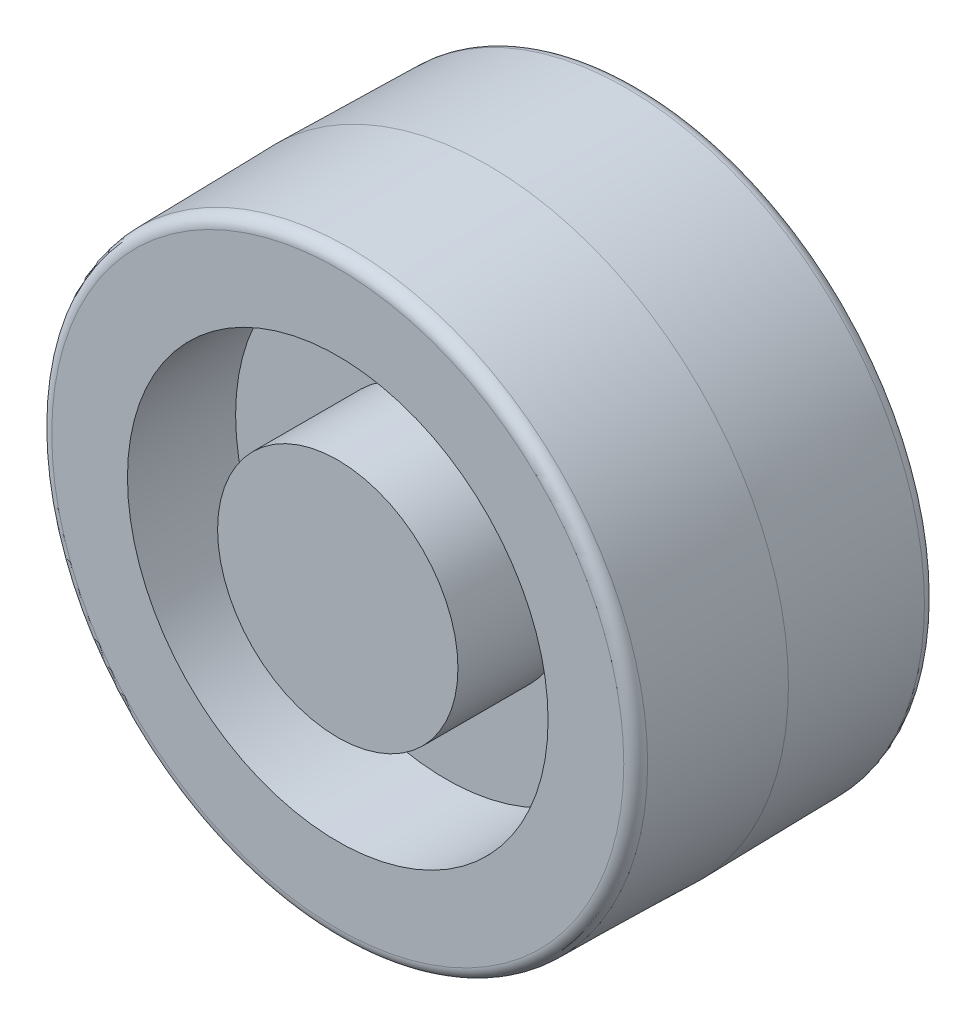
ISO-10303-21;
HEADER;
FILE_DESCRIPTION(('STEP AP214'),'2;1');
FILE_NAME('part.step','',(''),(''),'','','');
FILE_SCHEMA(('AUTOMOTIVE_DESIGN { 1 0 10303 214 1 1 1 1 }'));
ENDSEC;
DATA;
#1=APPLICATION_CONTEXT('core data for automotive mechanical design processes');
#2=APPLICATION_PROTOCOL_DEFINITION('international standard','automotive_design',2000,#1);
#3=PRODUCT_CONTEXT('',#1,'mechanical');
#4=PRODUCT('Part','Part','',(#3));
#5=PRODUCT_RELATED_PRODUCT_CATEGORY('part','',(#4));
#6=PRODUCT_DEFINITION_FORMATION('','',#4);
#7=PRODUCT_DEFINITION_CONTEXT('part definition',#1,'design');
#8=PRODUCT_DEFINITION('design','',#6,#7);
#9=PRODUCT_DEFINITION_SHAPE('','',#8);
#10=(LENGTH_UNIT() NAMED_UNIT(*) SI_UNIT(.MILLI.,.METRE.));
#11=(NAMED_UNIT(*) PLANE_ANGLE_UNIT() SI_UNIT($,.RADIAN.));
#12=(NAMED_UNIT(*) SI_UNIT($,.STERADIAN.) SOLID_ANGLE_UNIT());
#13=UNCERTAINTY_MEASURE_WITH_UNIT(LENGTH_MEASURE(1.E-05),#10,'distance_accuracy_value','');
#14=(GEOMETRIC_REPRESENTATION_CONTEXT(3) GLOBAL_UNCERTAINTY_ASSIGNED_CONTEXT((#13)) GLOBAL_UNIT_ASSIGNED_CONTEXT((#10,
#11,#12)) REPRESENTATION_CONTEXT('',''));
#15=CARTESIAN_POINT('',(0.,0.,0.));
#16=DIRECTION('',(0.,0.,1.));
#17=DIRECTION('',(1.,0.,0.));
#18=AXIS2_PLACEMENT_3D('',#15,#16,#17);
#19=CARTESIAN_POINT('',(31.03568429545,3.5,-12.5));
#20=DIRECTION('',(0.,0.,1.));
#21=DIRECTION('',(1.,0.,0.));
#22=AXIS2_PLACEMENT_3D('',#19,#20,#21);
#23=CYLINDRICAL_SURFACE('',#22,17.50047863118);
#24=CARTESIAN_POINT('',(31.03568429545,3.5,-3.5));
#25=DIRECTION('',(0.,0.,1.));
#26=DIRECTION('',(-1.,0.,0.));
#27=AXIS2_PLACEMENT_3D('',#24,#25,#26);
#28=CIRCLE('',#27,17.50047863118);
#29=CARTESIAN_POINT('',(13.53520566427,3.5,-3.5));
#30=VERTEX_POINT('',#29);
#31=EDGE_CURVE('E10',#30,#30,#28,.T.);
#32=ORIENTED_EDGE('',*,*,#31,.T.);
#33=EDGE_LOOP('',(#32));
#34=FACE_BOUND('',#33,.T.);
#35=CARTESIAN_POINT('',(31.03568429545,3.5,-12.5));
#36=DIRECTION('',(0.,0.,1.));
#37=DIRECTION('',(-1.,0.,0.));
#38=AXIS2_PLACEMENT_3D('',#35,#36,#37);
#39=CIRCLE('',#38,17.50047863118);
#40=CARTESIAN_POINT('',(13.53520566427,3.5,-12.5));
#41=VERTEX_POINT('',#40);
#42=EDGE_CURVE('E61',#41,#41,#39,.T.);
#43=ORIENTED_EDGE('',*,*,#42,.F.);
#44=EDGE_LOOP('',(#43));
#45=FACE_BOUND('',#44,.T.);
#46=ADVANCED_FACE('F15',(#34,#45),#23,.F.);
#47=CARTESIAN_POINT('',(0.,0.,-3.5));
#48=DIRECTION('',(0.,0.,1.));
#49=DIRECTION('',(1.,0.,0.));
#50=AXIS2_PLACEMENT_3D('',#47,#48,#49);
#51=PLANE('',#50);
#52=CARTESIAN_POINT('',(31.03568429545,3.5,-3.5));
#53=DIRECTION('',(0.,0.,-1.));
#54=DIRECTION('',(1.,0.,0.));
#55=AXIS2_PLACEMENT_3D('',#52,#53,#54);
#56=CIRCLE('',#55,10.);
#57=CARTESIAN_POINT('',(41.03568429545,3.5,-3.5));
#58=VERTEX_POINT('',#57);
#59=EDGE_CURVE('E22',#58,#58,#56,.T.);
#60=ORIENTED_EDGE('',*,*,#59,.F.);
#61=EDGE_LOOP('',(#60));
#62=FACE_BOUND('',#61,.T.);
#63=ORIENTED_EDGE('',*,*,#31,.F.);
#64=EDGE_LOOP('',(#63));
#65=FACE_BOUND('',#64,.T.);
#66=ADVANCED_FACE('F109',(#62,#65),#51,.F.);
#67=CARTESIAN_POINT('',(31.03568429545,3.5,-12.5));
#68=DIRECTION('',(0.,0.,1.));
#69=DIRECTION('',(1.,0.,0.));
#70=AXIS2_PLACEMENT_3D('',#67,#68,#69);
#71=CYLINDRICAL_SURFACE('',#70,10.);
#72=ORIENTED_EDGE('',*,*,#59,.T.);
#73=EDGE_LOOP('',(#72));
#74=FACE_BOUND('',#73,.T.);
#75=CARTESIAN_POINT('',(31.03568429545,3.5,-12.5));
#76=DIRECTION('',(0.,0.,1.));
#77=DIRECTION('',(1.,0.,0.));
#78=AXIS2_PLACEMENT_3D('',#75,#76,#77);
#79=CIRCLE('',#78,10.);
#80=CARTESIAN_POINT('',(41.03568429545,3.5,-12.5));
#81=VERTEX_POINT('',#80);
#82=EDGE_CURVE('E59',#81,#81,#79,.T.);
#83=ORIENTED_EDGE('',*,*,#82,.T.);
#84=EDGE_LOOP('',(#83));
#85=FACE_BOUND('',#84,.T.);
#86=ADVANCED_FACE('F113',(#74,#85),#71,.T.);
#87=CARTESIAN_POINT('',(31.03568429545,3.5,12.5));
#88=DIRECTION('',(0.,0.,1.));
#89=DIRECTION('',(1.,0.,0.));
#90=AXIS2_PLACEMENT_3D('',#87,#88,#89);
#91=CYLINDRICAL_SURFACE('',#90,17.50047863118);
#92=CARTESIAN_POINT('',(31.03568429545,3.5,3.5));
#93=DIRECTION('',(0.,0.,1.));
#94=DIRECTION('',(-1.,0.,0.));
#95=AXIS2_PLACEMENT_3D('',#92,#93,#94);
#96=CIRCLE('',#95,17.50047863118);
#97=CARTESIAN_POINT('',(13.53520566427,3.5,3.5));
#98=VERTEX_POINT('',#97);
#99=EDGE_CURVE('E31',#98,#98,#96,.T.);
#100=ORIENTED_EDGE('',*,*,#99,.F.);
#101=EDGE_LOOP('',(#100));
#102=FACE_BOUND('',#101,.T.);
#103=CARTESIAN_POINT('',(31.03568429545,3.5,12.5));
#104=DIRECTION('',(0.,0.,1.));
#105=DIRECTION('',(-1.,0.,0.));
#106=AXIS2_PLACEMENT_3D('',#103,#104,#105);
#107=CIRCLE('',#106,17.50047863118);
#108=CARTESIAN_POINT('',(13.53520566427,3.5,12.5));
#109=VERTEX_POINT('',#108);
#110=EDGE_CURVE('E48',#109,#109,#107,.T.);
#111=ORIENTED_EDGE('',*,*,#110,.T.);
#112=EDGE_LOOP('',(#111));
#113=FACE_BOUND('',#112,.T.);
#114=ADVANCED_FACE('F121',(#102,#113),#91,.F.);
#115=CARTESIAN_POINT('',(0.,0.,3.5));
#116=DIRECTION('',(0.,0.,1.));
#117=DIRECTION('',(1.,0.,0.));
#118=AXIS2_PLACEMENT_3D('',#115,#116,#117);
#119=PLANE('',#118);
#120=CARTESIAN_POINT('',(31.03568429545,3.5,3.5));
#121=DIRECTION('',(0.,0.,-1.));
#122=DIRECTION('',(1.,0.,0.));
#123=AXIS2_PLACEMENT_3D('',#120,#121,#122);
#124=CIRCLE('',#123,10.);
#125=CARTESIAN_POINT('',(41.03568429545,3.5,3.5));
#126=VERTEX_POINT('',#125);
#127=EDGE_CURVE('E38',#126,#126,#124,.T.);
#128=ORIENTED_EDGE('',*,*,#127,.T.);
#129=EDGE_LOOP('',(#128));
#130=FACE_BOUND('',#129,.T.);
#131=ORIENTED_EDGE('',*,*,#99,.T.);
#132=EDGE_LOOP('',(#131));
#133=FACE_BOUND('',#132,.T.);
#134=ADVANCED_FACE('F133',(#130,#133),#119,.T.);
#135=CARTESIAN_POINT('',(31.03568429545,3.5,12.5));
#136=DIRECTION('',(0.,0.,1.));
#137=DIRECTION('',(1.,0.,0.));
#138=AXIS2_PLACEMENT_3D('',#135,#136,#137);
#139=CYLINDRICAL_SURFACE('',#138,10.);
#140=ORIENTED_EDGE('',*,*,#127,.F.);
#141=EDGE_LOOP('',(#140));
#142=FACE_BOUND('',#141,.T.);
#143=CARTESIAN_POINT('',(31.03568429545,3.5,12.5));
#144=DIRECTION('',(0.,0.,1.));
#145=DIRECTION('',(1.,0.,0.));
#146=AXIS2_PLACEMENT_3D('',#143,#144,#145);
#147=CIRCLE('',#146,10.);
#148=CARTESIAN_POINT('',(41.03568429545,3.5,12.5));
#149=VERTEX_POINT('',#148);
#150=EDGE_CURVE('E44',#149,#149,#147,.T.);
#151=ORIENTED_EDGE('',*,*,#150,.F.);
#152=EDGE_LOOP('',(#151));
#153=FACE_BOUND('',#152,.T.);
#154=ADVANCED_FACE('F131',(#142,#153),#139,.T.);
#155=CARTESIAN_POINT('',(0.,0.,12.5));
#156=DIRECTION('',(0.,0.,1.));
#157=DIRECTION('',(1.,0.,0.));
#158=AXIS2_PLACEMENT_3D('',#155,#156,#157);
#159=PLANE('',#158);
#160=ORIENTED_EDGE('',*,*,#150,.T.);
#161=EDGE_LOOP('',(#160));
#162=FACE_BOUND('',#161,.T.);
#163=ADVANCED_FACE('F127',(#162),#159,.T.);
#164=CARTESIAN_POINT('',(0.,0.,12.5));
#165=DIRECTION('',(0.,0.,1.));
#166=DIRECTION('',(1.,0.,0.));
#167=AXIS2_PLACEMENT_3D('',#164,#165,#166);
#168=PLANE('',#167);
#169=ORIENTED_EDGE('',*,*,#110,.F.);
#170=EDGE_LOOP('',(#169));
#171=FACE_BOUND('',#170,.T.);
#172=CARTESIAN_POINT('',(31.03568429545,3.5,12.5));
#173=DIRECTION('',(0.,0.,1.));
#174=DIRECTION('',(-1.,0.,0.));
#175=AXIS2_PLACEMENT_3D('',#172,#173,#174);
#176=CIRCLE('',#175,23.79911442528);
#177=CARTESIAN_POINT('',(7.23656987017,3.5,12.5));
#178=VERTEX_POINT('',#177);
#179=EDGE_CURVE('E52',#178,#178,#176,.T.);
#180=ORIENTED_EDGE('',*,*,#179,.T.);
#181=EDGE_LOOP('',(#180));
#182=FACE_BOUND('',#181,.T.);
#183=ADVANCED_FACE('F130',(#171,#182),#168,.T.);
#184=CARTESIAN_POINT('',(31.03568429545,3.5,11.5));
#185=DIRECTION('',(0.,0.,1.));
#186=DIRECTION('',(-0.999969952688923,0.00775201388762917,0.));
#187=AXIS2_PLACEMENT_3D('',#184,#185,#186);
#188=TOROIDAL_SURFACE('',#187,23.79911442528,1.);
#189=CARTESIAN_POINT('',(31.03568429545,3.5,11.51745240644));
#190=DIRECTION('',(0.,0.,1.));
#191=DIRECTION('',(-1.,0.,0.));
#192=AXIS2_PLACEMENT_3D('',#189,#190,#191);
#193=CIRCLE('',#192,24.79896212044);
#194=CARTESIAN_POINT('',(6.23672217501,3.5,11.51745240644));
#195=VERTEX_POINT('',#194);
#196=EDGE_CURVE('E56',#195,#195,#193,.T.);
#197=ORIENTED_EDGE('',*,*,#196,.T.);
#198=EDGE_LOOP('',(#197));
#199=FACE_BOUND('',#198,.T.);
#200=ORIENTED_EDGE('',*,*,#179,.F.);
#201=EDGE_LOOP('',(#200));
#202=FACE_BOUND('',#201,.T.);
#203=ADVANCED_FACE('F125',(#199,#202),#188,.T.);
#204=CARTESIAN_POINT('',(31.03568429545,3.5,5.758726203219));
#205=DIRECTION('',(0.,0.,-1.));
#206=DIRECTION('',(-1.,0.,0.));
#207=AXIS2_PLACEMENT_3D('',#204,#205,#206);
#208=CONICAL_SURFACE('',#207,24.89948106022,0.0174532925199415);
#209=ORIENTED_EDGE('',*,*,#196,.F.);
#210=EDGE_LOOP('',(#209));
#211=FACE_BOUND('',#210,.T.);
#212=CARTESIAN_POINT('',(31.03568429545,3.5,-6.821210263297E-13));
#213=DIRECTION('',(0.,0.,1.));
#214=DIRECTION('',(1.,0.,0.));
#215=AXIS2_PLACEMENT_3D('',#212,#213,#214);
#216=CIRCLE('',#215,25.);
#217=CARTESIAN_POINT('',(56.03568429545,3.5,-6.821210263297E-13));
#218=VERTEX_POINT('',#217);
#219=EDGE_CURVE('E76',#218,#218,#216,.T.);
#220=ORIENTED_EDGE('',*,*,#219,.T.);
#221=EDGE_LOOP('',(#220));
#222=FACE_BOUND('',#221,.T.);
#223=ADVANCED_FACE('F83',(#211,#222),#208,.T.);
#224=CARTESIAN_POINT('',(0.,0.,-12.5));
#225=DIRECTION('',(0.,0.,1.));
#226=DIRECTION('',(1.,0.,0.));
#227=AXIS2_PLACEMENT_3D('',#224,#225,#226);
#228=PLANE('',#227);
#229=ORIENTED_EDGE('',*,*,#82,.F.);
#230=EDGE_LOOP('',(#229));
#231=FACE_BOUND('',#230,.T.);
#232=ADVANCED_FACE('F99',(#231),#228,.F.);
#233=CARTESIAN_POINT('',(0.,0.,-12.5));
#234=DIRECTION('',(0.,0.,1.));
#235=DIRECTION('',(1.,0.,0.));
#236=AXIS2_PLACEMENT_3D('',#233,#234,#235);
#237=PLANE('',#236);
#238=ORIENTED_EDGE('',*,*,#42,.T.);
#239=EDGE_LOOP('',(#238));
#240=FACE_BOUND('',#239,.T.);
#241=CARTESIAN_POINT('',(31.03568429545,3.5,-12.5));
#242=DIRECTION('',(0.,0.,-1.));
#243=DIRECTION('',(-1.,0.,0.));
#244=AXIS2_PLACEMENT_3D('',#241,#242,#243);
#245=CIRCLE('',#244,23.79911442528);
#246=CARTESIAN_POINT('',(7.23656987017,3.5,-12.5));
#247=VERTEX_POINT('',#246);
#248=EDGE_CURVE('E65',#247,#247,#245,.T.);
#249=ORIENTED_EDGE('',*,*,#248,.T.);
#250=EDGE_LOOP('',(#249));
#251=FACE_BOUND('',#250,.T.);
#252=ADVANCED_FACE('F94',(#240,#251),#237,.F.);
#253=CARTESIAN_POINT('',(31.03568429545,3.5,-11.5));
#254=DIRECTION('',(0.,0.,1.));
#255=DIRECTION('',(-0.9999393654864,-0.01101205478807,0.));
#256=AXIS2_PLACEMENT_3D('',#253,#254,#255);
#257=TOROIDAL_SURFACE('',#256,23.79911442528,1.);
#258=CARTESIAN_POINT('',(31.03568429545,3.5,-11.51745240644));
#259=DIRECTION('',(0.,0.,-1.));
#260=DIRECTION('',(-1.,0.,0.));
#261=AXIS2_PLACEMENT_3D('',#258,#259,#260);
#262=CIRCLE('',#261,24.79896212044);
#263=CARTESIAN_POINT('',(6.23672217501,3.5,-11.51745240644));
#264=VERTEX_POINT('',#263);
#265=EDGE_CURVE('E72',#264,#264,#262,.T.);
#266=ORIENTED_EDGE('',*,*,#265,.T.);
#267=EDGE_LOOP('',(#266));
#268=FACE_BOUND('',#267,.T.);
#269=ORIENTED_EDGE('',*,*,#248,.F.);
#270=EDGE_LOOP('',(#269));
#271=FACE_BOUND('',#270,.T.);
#272=ADVANCED_FACE('F88',(#268,#271),#257,.T.);
#273=CARTESIAN_POINT('',(31.03568429545,3.5,-5.758726203219));
#274=DIRECTION('',(0.,0.,1.));
#275=DIRECTION('',(1.,0.,0.));
#276=AXIS2_PLACEMENT_3D('',#273,#274,#275);
#277=CONICAL_SURFACE('',#276,24.89948106022,0.0174532925199415);
#278=ORIENTED_EDGE('',*,*,#219,.F.);
#279=EDGE_LOOP('',(#278));
#280=FACE_BOUND('',#279,.T.);
#281=ORIENTED_EDGE('',*,*,#265,.F.);
#282=EDGE_LOOP('',(#281));
#283=FACE_BOUND('',#282,.T.);
#284=ADVANCED_FACE('F85',(#280,#283),#277,.T.);
#285=CLOSED_SHELL('',(#46,#66,#86,#114,#134,#154,#163,#183,#203,#223,#232,#252,#272,#284));
#286=MANIFOLD_SOLID_BREP('B1',#285);
#287=ADVANCED_BREP_SHAPE_REPRESENTATION('',(#18,#286),#14);
#288=SHAPE_DEFINITION_REPRESENTATION(#9,#287);
ENDSEC;
END-ISO-10303-21;
